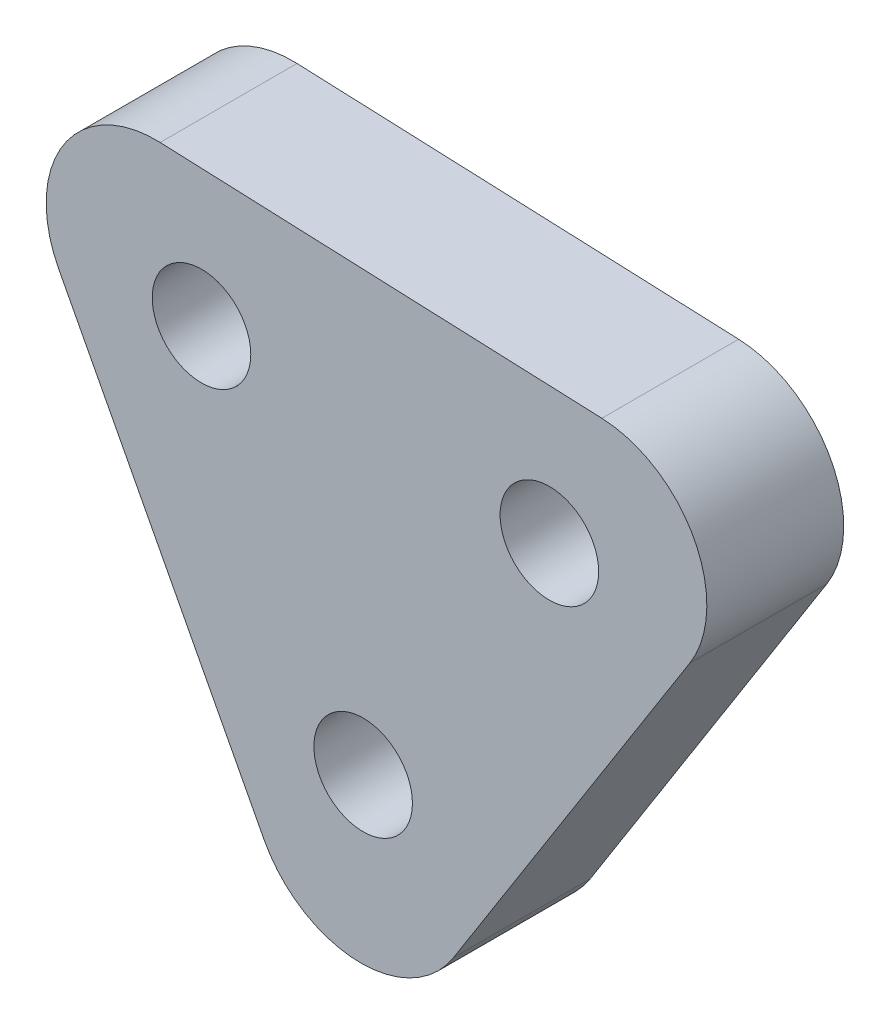
ISO-10303-21;
HEADER;
FILE_DESCRIPTION(('STEP AP214'),'2;1');
FILE_NAME('part.step','',(''),(''),'','','');
FILE_SCHEMA(('AUTOMOTIVE_DESIGN { 1 0 10303 214 1 1 1 1 }'));
ENDSEC;
DATA;
#1=APPLICATION_CONTEXT('core data for automotive mechanical design processes');
#2=APPLICATION_PROTOCOL_DEFINITION('international standard','automotive_design',2000,#1);
#3=PRODUCT_CONTEXT('',#1,'mechanical');
#4=PRODUCT('Part','Part','',(#3));
#5=PRODUCT_RELATED_PRODUCT_CATEGORY('part','',(#4));
#6=PRODUCT_DEFINITION_FORMATION('','',#4);
#7=PRODUCT_DEFINITION_CONTEXT('part definition',#1,'design');
#8=PRODUCT_DEFINITION('design','',#6,#7);
#9=PRODUCT_DEFINITION_SHAPE('','',#8);
#10=(LENGTH_UNIT() NAMED_UNIT(*) SI_UNIT(.MILLI.,.METRE.));
#11=(NAMED_UNIT(*) PLANE_ANGLE_UNIT() SI_UNIT($,.RADIAN.));
#12=(NAMED_UNIT(*) SI_UNIT($,.STERADIAN.) SOLID_ANGLE_UNIT());
#13=UNCERTAINTY_MEASURE_WITH_UNIT(LENGTH_MEASURE(1.E-05),#10,'distance_accuracy_value','');
#14=(GEOMETRIC_REPRESENTATION_CONTEXT(3) GLOBAL_UNCERTAINTY_ASSIGNED_CONTEXT((#13)) GLOBAL_UNIT_ASSIGNED_CONTEXT((#10,
#11,#12)) REPRESENTATION_CONTEXT('',''));
#15=CARTESIAN_POINT('',(0.,0.,0.));
#16=DIRECTION('',(0.,0.,1.));
#17=DIRECTION('',(1.,0.,0.));
#18=AXIS2_PLACEMENT_3D('',#15,#16,#17);
#19=CARTESIAN_POINT('',(0.,0.,5.));
#20=DIRECTION('',(0.,0.,1.));
#21=DIRECTION('',(1.,0.,0.));
#22=AXIS2_PLACEMENT_3D('',#19,#20,#21);
#23=PLANE('',#22);
#24=CARTESIAN_POINT('',(-24.3654036822982,6.94597797589015,5.));
#25=DIRECTION('',(0.,0.,1.));
#26=DIRECTION('',(1.,0.,0.));
#27=AXIS2_PLACEMENT_3D('',#24,#25,#26);
#28=CIRCLE('',#27,1.80000000000184);
#29=CARTESIAN_POINT('',(-22.5654036822964,6.94597797589015,5.));
#30=VERTEX_POINT('',#29);
#31=EDGE_CURVE('E164',#30,#30,#28,.T.);
#32=ORIENTED_EDGE('',*,*,#31,.F.);
#33=EDGE_LOOP('',(#32));
#34=FACE_BOUND('',#33,.T.);
#35=DIRECTION('',(0.464421866601223,-0.885614097574466,0.));
#36=VECTOR('',#35,1.);
#37=CARTESIAN_POINT('',(-18.866700045912,-14.2876268735127,5.));
#38=LINE('',#37,#36);
#39=CARTESIAN_POINT('',(-29.581254766924,6.1441430162307,5.));
#40=VERTEX_POINT('',#39);
#41=CARTESIAN_POINT('',(-22.0833250596938,-8.15378894795723,5.));
#42=VERTEX_POINT('',#41);
#43=EDGE_CURVE('E115',#40,#42,#38,.T.);
#44=ORIENTED_EDGE('',*,*,#43,.T.);
#45=CARTESIAN_POINT('',(-18.540868669396,-6.29610148155234,5.));
#46=DIRECTION('',(0.,0.,1.));
#47=DIRECTION('',(1.,0.,0.));
#48=AXIS2_PLACEMENT_3D('',#45,#46,#47);
#49=CIRCLE('',#48,4.);
#50=CARTESIAN_POINT('',(-15.161402728589,-8.43601034758515,5.));
#51=VERTEX_POINT('',#50);
#52=EDGE_CURVE('E131',#42,#51,#49,.T.);
#53=ORIENTED_EDGE('',*,*,#52,.T.);
#54=DIRECTION('',(0.534977216508202,0.844866485201736,0.));
#55=VECTOR('',#54,1.);
#56=CARTESIAN_POINT('',(-2.81738355066663,11.0583676825383,5.));
#57=LINE('',#56,#55);
#58=CARTESIAN_POINT('',(-6.5243814063741,5.20406556955493,5.));
#59=VERTEX_POINT('',#58);
#60=EDGE_CURVE('E105',#51,#59,#57,.T.);
#61=ORIENTED_EDGE('',*,*,#60,.T.);
#62=CARTESIAN_POINT('',(-9.90384734718105,7.34397443558774,5.));
#63=DIRECTION('',(0.,0.,1.));
#64=DIRECTION('',(1.,0.,0.));
#65=AXIS2_PLACEMENT_3D('',#62,#63,#64);
#66=CIRCLE('',#65,4.);
#67=CARTESIAN_POINT('',(-9.74089428258493,11.3406538446395,5.));
#68=VERTEX_POINT('',#67);
#69=EDGE_CURVE('E53',#59,#68,#66,.T.);
#70=ORIENTED_EDGE('',*,*,#69,.T.);
#71=DIRECTION('',(-0.999169852262953,0.0407382661490294,0.));
#72=VECTOR('',#71,1.);
#73=CARTESIAN_POINT('',(-32.7993560439848,12.2807960537901,5.));
#74=LINE('',#73,#72);
#75=CARTESIAN_POINT('',(-25.87584531203,11.9985098916874,5.));
#76=VERTEX_POINT('',#75);
#77=EDGE_CURVE('E121',#68,#76,#74,.T.);
#78=ORIENTED_EDGE('',*,*,#77,.T.);
#79=CARTESIAN_POINT('',(-26.0387983766262,8.00183048263559,5.));
#80=DIRECTION('',(0.,0.,1.));
#81=DIRECTION('',(1.,0.,0.));
#82=AXIS2_PLACEMENT_3D('',#79,#80,#81);
#83=CIRCLE('',#82,4.);
#84=EDGE_CURVE('E129',#76,#40,#83,.T.);
#85=ORIENTED_EDGE('',*,*,#84,.T.);
#86=EDGE_LOOP('',(#44,#53,#61,#70,#78,#85));
#87=FACE_BOUND('',#86,.T.);
#88=CARTESIAN_POINT('',(-18.4595256993976,-4.30103760154522,5.));
#89=DIRECTION('',(0.,0.,1.));
#90=DIRECTION('',(1.,0.,0.));
#91=AXIS2_PLACEMENT_3D('',#88,#89,#90);
#92=CIRCLE('',#91,1.8000000000146);
#93=CARTESIAN_POINT('',(-16.659525699383,-4.30103760154522,5.));
#94=VERTEX_POINT('',#93);
#95=EDGE_CURVE('E117',#94,#94,#92,.T.);
#96=ORIENTED_EDGE('',*,*,#95,.F.);
#97=EDGE_LOOP('',(#96));
#98=FACE_BOUND('',#97,.T.);
#99=CARTESIAN_POINT('',(-11.6576434742537,6.4278557405627,5.));
#100=DIRECTION('',(0.,0.,1.));
#101=DIRECTION('',(1.,0.,0.));
#102=AXIS2_PLACEMENT_3D('',#99,#100,#101);
#103=CIRCLE('',#102,1.7999999999998);
#104=CARTESIAN_POINT('',(-9.85764347425394,6.4278557405627,5.));
#105=VERTEX_POINT('',#104);
#106=EDGE_CURVE('E158',#105,#105,#103,.T.);
#107=ORIENTED_EDGE('',*,*,#106,.F.);
#108=EDGE_LOOP('',(#107));
#109=FACE_BOUND('',#108,.T.);
#110=ADVANCED_FACE('F33',(#34,#87,#98,#109),#23,.T.);
#111=CARTESIAN_POINT('',(0.,0.,0.));
#112=DIRECTION('',(0.,0.,1.));
#113=DIRECTION('',(1.,0.,0.));
#114=AXIS2_PLACEMENT_3D('',#111,#112,#113);
#115=PLANE('',#114);
#116=DIRECTION('',(0.534977216508202,0.844866485201736,0.));
#117=VECTOR('',#116,1.);
#118=CARTESIAN_POINT('',(-2.81738355066663,11.0583676825383,0.));
#119=LINE('',#118,#117);
#120=CARTESIAN_POINT('',(-15.161402728589,-8.43601034758515,0.));
#121=VERTEX_POINT('',#120);
#122=CARTESIAN_POINT('',(-6.5243814063741,5.20406556955493,0.));
#123=VERTEX_POINT('',#122);
#124=EDGE_CURVE('E103',#121,#123,#119,.T.);
#125=ORIENTED_EDGE('',*,*,#124,.F.);
#126=CARTESIAN_POINT('',(-18.540868669396,-6.29610148155234,0.));
#127=DIRECTION('',(0.,0.,1.));
#128=DIRECTION('',(1.,0.,0.));
#129=AXIS2_PLACEMENT_3D('',#126,#127,#128);
#130=CIRCLE('',#129,4.);
#131=CARTESIAN_POINT('',(-22.0833250596938,-8.15378894795723,0.));
#132=VERTEX_POINT('',#131);
#133=EDGE_CURVE('E86',#121,#132,#130,.F.);
#134=ORIENTED_EDGE('',*,*,#133,.T.);
#135=DIRECTION('',(0.464421866601223,-0.885614097574466,0.));
#136=VECTOR('',#135,1.);
#137=CARTESIAN_POINT('',(-18.866700045912,-14.2876268735127,0.));
#138=LINE('',#137,#136);
#139=CARTESIAN_POINT('',(-29.581254766924,6.1441430162307,0.));
#140=VERTEX_POINT('',#139);
#141=EDGE_CURVE('E113',#140,#132,#138,.T.);
#142=ORIENTED_EDGE('',*,*,#141,.F.);
#143=CARTESIAN_POINT('',(-26.0387983766262,8.00183048263559,0.));
#144=DIRECTION('',(0.,0.,1.));
#145=DIRECTION('',(1.,0.,0.));
#146=AXIS2_PLACEMENT_3D('',#143,#144,#145);
#147=CIRCLE('',#146,4.);
#148=CARTESIAN_POINT('',(-25.87584531203,11.9985098916874,0.));
#149=VERTEX_POINT('',#148);
#150=EDGE_CURVE('E97',#140,#149,#147,.F.);
#151=ORIENTED_EDGE('',*,*,#150,.T.);
#152=DIRECTION('',(-0.999169852262953,0.0407382661490294,0.));
#153=VECTOR('',#152,1.);
#154=CARTESIAN_POINT('',(-32.7993560439848,12.2807960537901,0.));
#155=LINE('',#154,#153);
#156=CARTESIAN_POINT('',(-9.74089428258493,11.3406538446395,0.));
#157=VERTEX_POINT('',#156);
#158=EDGE_CURVE('E112',#157,#149,#155,.T.);
#159=ORIENTED_EDGE('',*,*,#158,.F.);
#160=CARTESIAN_POINT('',(-9.90384734718105,7.34397443558774,0.));
#161=DIRECTION('',(0.,0.,1.));
#162=DIRECTION('',(1.,0.,0.));
#163=AXIS2_PLACEMENT_3D('',#160,#161,#162);
#164=CIRCLE('',#163,4.);
#165=EDGE_CURVE('E106',#157,#123,#164,.F.);
#166=ORIENTED_EDGE('',*,*,#165,.T.);
#167=EDGE_LOOP('',(#125,#134,#142,#151,#159,#166));
#168=FACE_BOUND('',#167,.T.);
#169=CARTESIAN_POINT('',(-18.4595256993976,-4.30103760154522,0.));
#170=DIRECTION('',(0.,0.,1.));
#171=DIRECTION('',(1.,0.,0.));
#172=AXIS2_PLACEMENT_3D('',#169,#170,#171);
#173=CIRCLE('',#172,1.8000000000146);
#174=CARTESIAN_POINT('',(-16.659525699383,-4.30103760154522,0.));
#175=VERTEX_POINT('',#174);
#176=EDGE_CURVE('E147',#175,#175,#173,.T.);
#177=ORIENTED_EDGE('',*,*,#176,.T.);
#178=EDGE_LOOP('',(#177));
#179=FACE_BOUND('',#178,.T.);
#180=CARTESIAN_POINT('',(-24.3654036822982,6.94597797589015,0.));
#181=DIRECTION('',(0.,0.,1.));
#182=DIRECTION('',(1.,0.,0.));
#183=AXIS2_PLACEMENT_3D('',#180,#181,#182);
#184=CIRCLE('',#183,1.80000000000184);
#185=CARTESIAN_POINT('',(-22.5654036822964,6.94597797589015,0.));
#186=VERTEX_POINT('',#185);
#187=EDGE_CURVE('E160',#186,#186,#184,.T.);
#188=ORIENTED_EDGE('',*,*,#187,.T.);
#189=EDGE_LOOP('',(#188));
#190=FACE_BOUND('',#189,.T.);
#191=CARTESIAN_POINT('',(-11.6576434742537,6.4278557405627,0.));
#192=DIRECTION('',(0.,0.,1.));
#193=DIRECTION('',(1.,0.,0.));
#194=AXIS2_PLACEMENT_3D('',#191,#192,#193);
#195=CIRCLE('',#194,1.7999999999998);
#196=CARTESIAN_POINT('',(-9.85764347425394,6.4278557405627,0.));
#197=VERTEX_POINT('',#196);
#198=EDGE_CURVE('E161',#197,#197,#195,.T.);
#199=ORIENTED_EDGE('',*,*,#198,.T.);
#200=EDGE_LOOP('',(#199));
#201=FACE_BOUND('',#200,.T.);
#202=ADVANCED_FACE('F109',(#168,#179,#190,#201),#115,.F.);
#203=CARTESIAN_POINT('',(-18.866700045912,-14.2876268735127,5.));
#204=DIRECTION('',(0.885614097574466,0.464421866601223,0.));
#205=DIRECTION('',(-0.464421866601223,0.885614097574466,0.));
#206=AXIS2_PLACEMENT_3D('',#203,#204,#205);
#207=PLANE('',#206);
#208=ORIENTED_EDGE('',*,*,#141,.T.);
#209=DIRECTION('',(0.,0.,-1.));
#210=VECTOR('',#209,1.);
#211=CARTESIAN_POINT('',(-22.0833250596938,-8.15378894795723,5.));
#212=LINE('',#211,#210);
#213=EDGE_CURVE('E91',#132,#42,#212,.F.);
#214=ORIENTED_EDGE('',*,*,#213,.T.);
#215=ORIENTED_EDGE('',*,*,#43,.F.);
#216=DIRECTION('',(0.,0.,-1.));
#217=VECTOR('',#216,1.);
#218=CARTESIAN_POINT('',(-29.581254766924,6.1441430162307,5.));
#219=LINE('',#218,#217);
#220=EDGE_CURVE('E96',#40,#140,#219,.T.);
#221=ORIENTED_EDGE('',*,*,#220,.T.);
#222=EDGE_LOOP('',(#208,#214,#215,#221));
#223=FACE_BOUND('',#222,.T.);
#224=ADVANCED_FACE('F142',(#223),#207,.F.);
#225=CARTESIAN_POINT('',(-2.81738355066663,11.0583676825383,5.));
#226=DIRECTION('',(-0.844866485201736,0.534977216508202,0.));
#227=DIRECTION('',(-0.534977216508202,-0.844866485201736,0.));
#228=AXIS2_PLACEMENT_3D('',#225,#226,#227);
#229=PLANE('',#228);
#230=ORIENTED_EDGE('',*,*,#60,.F.);
#231=DIRECTION('',(0.,0.,-1.));
#232=VECTOR('',#231,1.);
#233=CARTESIAN_POINT('',(-15.161402728589,-8.43601034758515,5.));
#234=LINE('',#233,#232);
#235=EDGE_CURVE('E90',#51,#121,#234,.T.);
#236=ORIENTED_EDGE('',*,*,#235,.T.);
#237=ORIENTED_EDGE('',*,*,#124,.T.);
#238=DIRECTION('',(0.,0.,-1.));
#239=VECTOR('',#238,1.);
#240=CARTESIAN_POINT('',(-6.5243814063741,5.20406556955493,5.));
#241=LINE('',#240,#239);
#242=EDGE_CURVE('E107',#123,#59,#241,.F.);
#243=ORIENTED_EDGE('',*,*,#242,.T.);
#244=EDGE_LOOP('',(#230,#236,#237,#243));
#245=FACE_BOUND('',#244,.T.);
#246=ADVANCED_FACE('F102',(#245),#229,.F.);
#247=CARTESIAN_POINT('',(-32.7993560439848,12.2807960537901,5.));
#248=DIRECTION('',(-0.0407382661490294,-0.999169852262953,0.));
#249=DIRECTION('',(0.999169852262953,-0.0407382661490294,0.));
#250=AXIS2_PLACEMENT_3D('',#247,#248,#249);
#251=PLANE('',#250);
#252=ORIENTED_EDGE('',*,*,#158,.T.);
#253=DIRECTION('',(0.,0.,-1.));
#254=VECTOR('',#253,1.);
#255=CARTESIAN_POINT('',(-25.87584531203,11.9985098916874,5.));
#256=LINE('',#255,#254);
#257=EDGE_CURVE('E11',#149,#76,#256,.F.);
#258=ORIENTED_EDGE('',*,*,#257,.T.);
#259=ORIENTED_EDGE('',*,*,#77,.F.);
#260=DIRECTION('',(0.,0.,-1.));
#261=VECTOR('',#260,1.);
#262=CARTESIAN_POINT('',(-9.74089428258493,11.3406538446395,5.));
#263=LINE('',#262,#261);
#264=EDGE_CURVE('E41',#68,#157,#263,.T.);
#265=ORIENTED_EDGE('',*,*,#264,.T.);
#266=EDGE_LOOP('',(#252,#258,#259,#265));
#267=FACE_BOUND('',#266,.T.);
#268=ADVANCED_FACE('F134',(#267),#251,.F.);
#269=CARTESIAN_POINT('',(-18.4595256993976,-4.30103760154522,5.));
#270=DIRECTION('',(0.,0.,-1.));
#271=DIRECTION('',(-1.,0.,0.));
#272=AXIS2_PLACEMENT_3D('',#269,#270,#271);
#273=CYLINDRICAL_SURFACE('',#272,1.8000000000146);
#274=ORIENTED_EDGE('',*,*,#95,.T.);
#275=EDGE_LOOP('',(#274));
#276=FACE_BOUND('',#275,.T.);
#277=ORIENTED_EDGE('',*,*,#176,.F.);
#278=EDGE_LOOP('',(#277));
#279=FACE_BOUND('',#278,.T.);
#280=ADVANCED_FACE('F175',(#276,#279),#273,.F.);
#281=CARTESIAN_POINT('',(-24.3654036822982,6.94597797589015,5.));
#282=DIRECTION('',(0.,0.,-1.));
#283=DIRECTION('',(-1.,0.,0.));
#284=AXIS2_PLACEMENT_3D('',#281,#282,#283);
#285=CYLINDRICAL_SURFACE('',#284,1.80000000000184);
#286=ORIENTED_EDGE('',*,*,#31,.T.);
#287=EDGE_LOOP('',(#286));
#288=FACE_BOUND('',#287,.T.);
#289=ORIENTED_EDGE('',*,*,#187,.F.);
#290=EDGE_LOOP('',(#289));
#291=FACE_BOUND('',#290,.T.);
#292=ADVANCED_FACE('F177',(#288,#291),#285,.F.);
#293=CARTESIAN_POINT('',(-11.6576434742537,6.4278557405627,5.));
#294=DIRECTION('',(0.,0.,-1.));
#295=DIRECTION('',(-1.,0.,0.));
#296=AXIS2_PLACEMENT_3D('',#293,#294,#295);
#297=CYLINDRICAL_SURFACE('',#296,1.7999999999998);
#298=ORIENTED_EDGE('',*,*,#106,.T.);
#299=EDGE_LOOP('',(#298));
#300=FACE_BOUND('',#299,.T.);
#301=ORIENTED_EDGE('',*,*,#198,.F.);
#302=EDGE_LOOP('',(#301));
#303=FACE_BOUND('',#302,.T.);
#304=ADVANCED_FACE('F183',(#300,#303),#297,.F.);
#305=CARTESIAN_POINT('',(-18.540868669396,-6.29610148155234,5.));
#306=DIRECTION('',(0.,0.,-1.));
#307=DIRECTION('',(-1.,0.,0.));
#308=AXIS2_PLACEMENT_3D('',#305,#306,#307);
#309=CYLINDRICAL_SURFACE('',#308,4.);
#310=ORIENTED_EDGE('',*,*,#52,.F.);
#311=ORIENTED_EDGE('',*,*,#213,.F.);
#312=ORIENTED_EDGE('',*,*,#133,.F.);
#313=ORIENTED_EDGE('',*,*,#235,.F.);
#314=EDGE_LOOP('',(#310,#311,#312,#313));
#315=FACE_BOUND('',#314,.T.);
#316=ADVANCED_FACE('F89',(#315),#309,.T.);
#317=CARTESIAN_POINT('',(-26.0387983766262,8.00183048263559,5.));
#318=DIRECTION('',(0.,0.,-1.));
#319=DIRECTION('',(-1.,0.,0.));
#320=AXIS2_PLACEMENT_3D('',#317,#318,#319);
#321=CYLINDRICAL_SURFACE('',#320,4.);
#322=ORIENTED_EDGE('',*,*,#84,.F.);
#323=ORIENTED_EDGE('',*,*,#257,.F.);
#324=ORIENTED_EDGE('',*,*,#150,.F.);
#325=ORIENTED_EDGE('',*,*,#220,.F.);
#326=EDGE_LOOP('',(#322,#323,#324,#325));
#327=FACE_BOUND('',#326,.T.);
#328=ADVANCED_FACE('F139',(#327),#321,.T.);
#329=CARTESIAN_POINT('',(-9.90384734718105,7.34397443558774,5.));
#330=DIRECTION('',(0.,0.,-1.));
#331=DIRECTION('',(-1.,0.,0.));
#332=AXIS2_PLACEMENT_3D('',#329,#330,#331);
#333=CYLINDRICAL_SURFACE('',#332,4.);
#334=ORIENTED_EDGE('',*,*,#69,.F.);
#335=ORIENTED_EDGE('',*,*,#242,.F.);
#336=ORIENTED_EDGE('',*,*,#165,.F.);
#337=ORIENTED_EDGE('',*,*,#264,.F.);
#338=EDGE_LOOP('',(#334,#335,#336,#337));
#339=FACE_BOUND('',#338,.T.);
#340=ADVANCED_FACE('F35',(#339),#333,.T.);
#341=CLOSED_SHELL('',(#110,#202,#224,#246,#268,#280,#292,#304,#316,#328,#340));
#342=MANIFOLD_SOLID_BREP('B2',#341);
#343=ADVANCED_BREP_SHAPE_REPRESENTATION('',(#18,#342),#14);
#344=SHAPE_DEFINITION_REPRESENTATION(#9,#343);
ENDSEC;
END-ISO-10303-21;
